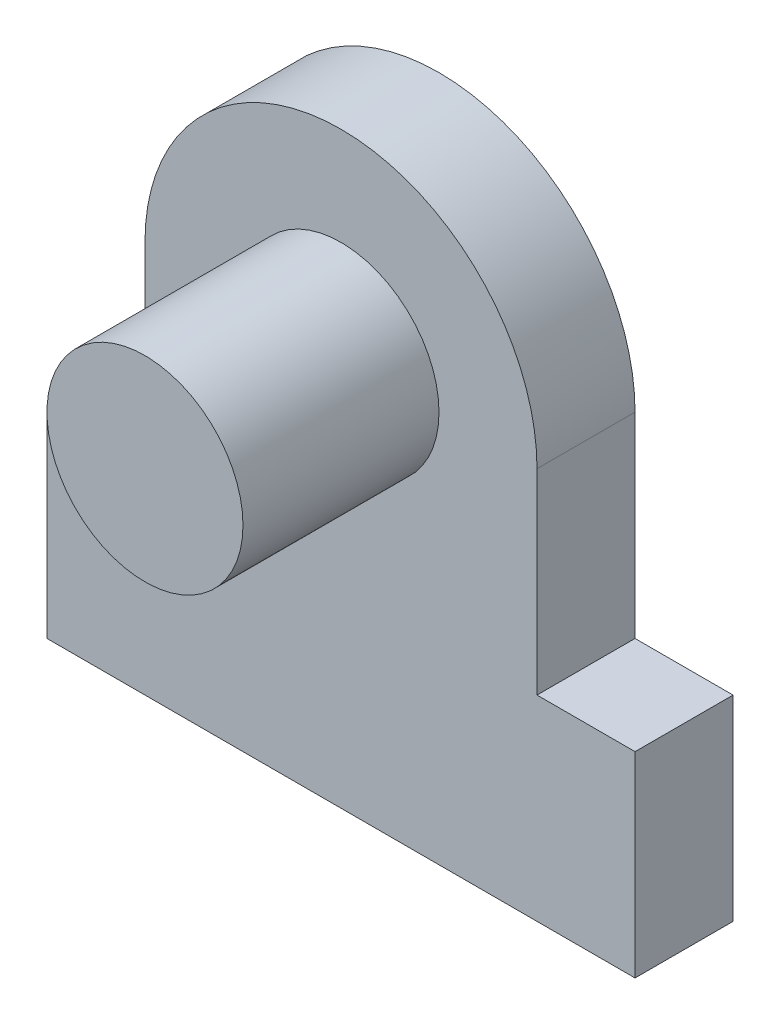
ISO-10303-21;
HEADER;
FILE_DESCRIPTION(('STEP AP214'),'2;1');
FILE_NAME('part.step','',(''),(''),'','','');
FILE_SCHEMA(('AUTOMOTIVE_DESIGN { 1 0 10303 214 1 1 1 1 }'));
ENDSEC;
DATA;
#1=APPLICATION_CONTEXT('core data for automotive mechanical design processes');
#2=APPLICATION_PROTOCOL_DEFINITION('international standard','automotive_design',2000,#1);
#3=PRODUCT_CONTEXT('',#1,'mechanical');
#4=PRODUCT('Part','Part','',(#3));
#5=PRODUCT_RELATED_PRODUCT_CATEGORY('part','',(#4));
#6=PRODUCT_DEFINITION_FORMATION('','',#4);
#7=PRODUCT_DEFINITION_CONTEXT('part definition',#1,'design');
#8=PRODUCT_DEFINITION('design','',#6,#7);
#9=PRODUCT_DEFINITION_SHAPE('','',#8);
#10=(LENGTH_UNIT() NAMED_UNIT(*) SI_UNIT(.MILLI.,.METRE.));
#11=(NAMED_UNIT(*) PLANE_ANGLE_UNIT() SI_UNIT($,.RADIAN.));
#12=(NAMED_UNIT(*) SI_UNIT($,.STERADIAN.) SOLID_ANGLE_UNIT());
#13=UNCERTAINTY_MEASURE_WITH_UNIT(LENGTH_MEASURE(1.E-05),#10,'distance_accuracy_value','');
#14=(GEOMETRIC_REPRESENTATION_CONTEXT(3) GLOBAL_UNCERTAINTY_ASSIGNED_CONTEXT((#13)) GLOBAL_UNIT_ASSIGNED_CONTEXT((#10,
#11,#12)) REPRESENTATION_CONTEXT('',''));
#15=CARTESIAN_POINT('',(0.,0.,0.));
#16=DIRECTION('',(0.,0.,1.));
#17=DIRECTION('',(1.,0.,0.));
#18=AXIS2_PLACEMENT_3D('',#15,#16,#17);
#19=CARTESIAN_POINT('',(30.,0.,10.));
#20=DIRECTION('',(-1.,0.,0.));
#21=DIRECTION('',(0.,0.,1.));
#22=AXIS2_PLACEMENT_3D('',#19,#20,#21);
#23=PLANE('',#22);
#24=DIRECTION('',(0.,1.,0.));
#25=VECTOR('',#24,1.);
#26=CARTESIAN_POINT('',(30.,0.,0.));
#27=LINE('',#26,#25);
#28=CARTESIAN_POINT('',(30.,0.,0.));
#29=VERTEX_POINT('',#28);
#30=CARTESIAN_POINT('',(30.,20.,0.));
#31=VERTEX_POINT('',#30);
#32=EDGE_CURVE('E129',#29,#31,#27,.T.);
#33=ORIENTED_EDGE('',*,*,#32,.T.);
#34=DIRECTION('',(0.,0.,-1.));
#35=VECTOR('',#34,1.);
#36=CARTESIAN_POINT('',(30.,20.,10.));
#37=LINE('',#36,#35);
#38=CARTESIAN_POINT('',(30.,20.,10.));
#39=VERTEX_POINT('',#38);
#40=EDGE_CURVE('E11',#39,#31,#37,.T.);
#41=ORIENTED_EDGE('',*,*,#40,.F.);
#42=DIRECTION('',(0.,1.,0.));
#43=VECTOR('',#42,1.);
#44=CARTESIAN_POINT('',(30.,0.,10.));
#45=LINE('',#44,#43);
#46=CARTESIAN_POINT('',(30.,0.,10.));
#47=VERTEX_POINT('',#46);
#48=EDGE_CURVE('E144',#47,#39,#45,.T.);
#49=ORIENTED_EDGE('',*,*,#48,.F.);
#50=DIRECTION('',(0.,0.,-1.));
#51=VECTOR('',#50,1.);
#52=CARTESIAN_POINT('',(30.,0.,10.));
#53=LINE('',#52,#51);
#54=EDGE_CURVE('E125',#47,#29,#53,.T.);
#55=ORIENTED_EDGE('',*,*,#54,.T.);
#56=EDGE_LOOP('',(#33,#41,#49,#55));
#57=FACE_BOUND('',#56,.T.);
#58=ADVANCED_FACE('F33',(#57),#23,.F.);
#59=CARTESIAN_POINT('',(30.,20.,10.));
#60=DIRECTION('',(0.,-1.,0.));
#61=DIRECTION('',(0.,0.,-1.));
#62=AXIS2_PLACEMENT_3D('',#59,#60,#61);
#63=PLANE('',#62);
#64=DIRECTION('',(-1.,0.,0.));
#65=VECTOR('',#64,1.);
#66=CARTESIAN_POINT('',(30.,20.,0.));
#67=LINE('',#66,#65);
#68=CARTESIAN_POINT('',(20.,20.,0.));
#69=VERTEX_POINT('',#68);
#70=EDGE_CURVE('E132',#31,#69,#67,.T.);
#71=ORIENTED_EDGE('',*,*,#70,.T.);
#72=DIRECTION('',(0.,0.,-1.));
#73=VECTOR('',#72,1.);
#74=CARTESIAN_POINT('',(20.,20.,10.));
#75=LINE('',#74,#73);
#76=CARTESIAN_POINT('',(20.,20.,10.));
#77=VERTEX_POINT('',#76);
#78=EDGE_CURVE('E41',#77,#69,#75,.T.);
#79=ORIENTED_EDGE('',*,*,#78,.F.);
#80=DIRECTION('',(-1.,0.,0.));
#81=VECTOR('',#80,1.);
#82=CARTESIAN_POINT('',(30.,20.,10.));
#83=LINE('',#82,#81);
#84=EDGE_CURVE('E92',#39,#77,#83,.T.);
#85=ORIENTED_EDGE('',*,*,#84,.F.);
#86=ORIENTED_EDGE('',*,*,#40,.T.);
#87=EDGE_LOOP('',(#71,#79,#85,#86));
#88=FACE_BOUND('',#87,.T.);
#89=ADVANCED_FACE('F201',(#88),#63,.F.);
#90=CARTESIAN_POINT('',(20.,20.,10.));
#91=DIRECTION('',(-1.,0.,0.));
#92=DIRECTION('',(0.,0.,1.));
#93=AXIS2_PLACEMENT_3D('',#90,#91,#92);
#94=PLANE('',#93);
#95=DIRECTION('',(0.,1.,0.));
#96=VECTOR('',#95,1.);
#97=CARTESIAN_POINT('',(20.,20.,0.));
#98=LINE('',#97,#96);
#99=CARTESIAN_POINT('',(20.,40.,0.));
#100=VERTEX_POINT('',#99);
#101=EDGE_CURVE('E135',#69,#100,#98,.T.);
#102=ORIENTED_EDGE('',*,*,#101,.T.);
#103=DIRECTION('',(0.,0.,-1.));
#104=VECTOR('',#103,1.);
#105=CARTESIAN_POINT('',(20.,40.,10.));
#106=LINE('',#105,#104);
#107=CARTESIAN_POINT('',(20.,40.,10.));
#108=VERTEX_POINT('',#107);
#109=EDGE_CURVE('E151',#108,#100,#106,.T.);
#110=ORIENTED_EDGE('',*,*,#109,.F.);
#111=DIRECTION('',(0.,1.,0.));
#112=VECTOR('',#111,1.);
#113=CARTESIAN_POINT('',(20.,20.,10.));
#114=LINE('',#113,#112);
#115=EDGE_CURVE('E159',#77,#108,#114,.T.);
#116=ORIENTED_EDGE('',*,*,#115,.F.);
#117=ORIENTED_EDGE('',*,*,#78,.T.);
#118=EDGE_LOOP('',(#102,#110,#116,#117));
#119=FACE_BOUND('',#118,.T.);
#120=ADVANCED_FACE('F157',(#119),#94,.F.);
#121=CARTESIAN_POINT('',(0.,40.,10.));
#122=DIRECTION('',(0.,0.,-1.));
#123=DIRECTION('',(-1.,0.,0.));
#124=AXIS2_PLACEMENT_3D('',#121,#122,#123);
#125=CYLINDRICAL_SURFACE('',#124,20.);
#126=CARTESIAN_POINT('',(0.,40.,0.));
#127=DIRECTION('',(0.,0.,1.));
#128=DIRECTION('',(1.,0.,0.));
#129=AXIS2_PLACEMENT_3D('',#126,#127,#128);
#130=CIRCLE('',#129,20.);
#131=CARTESIAN_POINT('',(-20.,40.,0.));
#132=VERTEX_POINT('',#131);
#133=EDGE_CURVE('E137',#100,#132,#130,.T.);
#134=ORIENTED_EDGE('',*,*,#133,.T.);
#135=DIRECTION('',(0.,0.,-1.));
#136=VECTOR('',#135,1.);
#137=CARTESIAN_POINT('',(-20.,40.,10.));
#138=LINE('',#137,#136);
#139=CARTESIAN_POINT('',(-20.,40.,10.));
#140=VERTEX_POINT('',#139);
#141=EDGE_CURVE('E148',#140,#132,#138,.T.);
#142=ORIENTED_EDGE('',*,*,#141,.F.);
#143=CARTESIAN_POINT('',(0.,40.,10.));
#144=DIRECTION('',(0.,0.,1.));
#145=DIRECTION('',(1.,0.,0.));
#146=AXIS2_PLACEMENT_3D('',#143,#144,#145);
#147=CIRCLE('',#146,20.);
#148=EDGE_CURVE('E171',#108,#140,#147,.T.);
#149=ORIENTED_EDGE('',*,*,#148,.F.);
#150=ORIENTED_EDGE('',*,*,#109,.T.);
#151=EDGE_LOOP('',(#134,#142,#149,#150));
#152=FACE_BOUND('',#151,.T.);
#153=ADVANCED_FACE('F167',(#152),#125,.T.);
#154=CARTESIAN_POINT('',(-20.,20.,10.));
#155=DIRECTION('',(1.,0.,0.));
#156=DIRECTION('',(0.,0.,-1.));
#157=AXIS2_PLACEMENT_3D('',#154,#155,#156);
#158=PLANE('',#157);
#159=DIRECTION('',(0.,-1.,0.));
#160=VECTOR('',#159,1.);
#161=CARTESIAN_POINT('',(-20.,20.,0.));
#162=LINE('',#161,#160);
#163=CARTESIAN_POINT('',(-20.,20.,0.));
#164=VERTEX_POINT('',#163);
#165=EDGE_CURVE('E139',#132,#164,#162,.T.);
#166=ORIENTED_EDGE('',*,*,#165,.T.);
#167=DIRECTION('',(0.,0.,-1.));
#168=VECTOR('',#167,1.);
#169=CARTESIAN_POINT('',(-20.,20.,10.));
#170=LINE('',#169,#168);
#171=CARTESIAN_POINT('',(-20.,20.,10.));
#172=VERTEX_POINT('',#171);
#173=EDGE_CURVE('E120',#172,#164,#170,.T.);
#174=ORIENTED_EDGE('',*,*,#173,.F.);
#175=DIRECTION('',(0.,-1.,0.));
#176=VECTOR('',#175,1.);
#177=CARTESIAN_POINT('',(-20.,20.,10.));
#178=LINE('',#177,#176);
#179=EDGE_CURVE('E111',#140,#172,#178,.T.);
#180=ORIENTED_EDGE('',*,*,#179,.F.);
#181=ORIENTED_EDGE('',*,*,#141,.T.);
#182=EDGE_LOOP('',(#166,#174,#180,#181));
#183=FACE_BOUND('',#182,.T.);
#184=ADVANCED_FACE('F170',(#183),#158,.F.);
#185=CARTESIAN_POINT('',(-30.,20.,10.));
#186=DIRECTION('',(0.,-1.,0.));
#187=DIRECTION('',(0.,0.,-1.));
#188=AXIS2_PLACEMENT_3D('',#185,#186,#187);
#189=PLANE('',#188);
#190=DIRECTION('',(-1.,0.,0.));
#191=VECTOR('',#190,1.);
#192=CARTESIAN_POINT('',(-30.,20.,0.));
#193=LINE('',#192,#191);
#194=CARTESIAN_POINT('',(-30.,20.,0.));
#195=VERTEX_POINT('',#194);
#196=EDGE_CURVE('E119',#164,#195,#193,.T.);
#197=ORIENTED_EDGE('',*,*,#196,.T.);
#198=DIRECTION('',(0.,0.,-1.));
#199=VECTOR('',#198,1.);
#200=CARTESIAN_POINT('',(-30.,20.,10.));
#201=LINE('',#200,#199);
#202=CARTESIAN_POINT('',(-30.,20.,10.));
#203=VERTEX_POINT('',#202);
#204=EDGE_CURVE('E116',#203,#195,#201,.T.);
#205=ORIENTED_EDGE('',*,*,#204,.F.);
#206=DIRECTION('',(-1.,0.,0.));
#207=VECTOR('',#206,1.);
#208=CARTESIAN_POINT('',(-30.,20.,10.));
#209=LINE('',#208,#207);
#210=EDGE_CURVE('E105',#172,#203,#209,.T.);
#211=ORIENTED_EDGE('',*,*,#210,.F.);
#212=ORIENTED_EDGE('',*,*,#173,.T.);
#213=EDGE_LOOP('',(#197,#205,#211,#212));
#214=FACE_BOUND('',#213,.T.);
#215=ADVANCED_FACE('F117',(#214),#189,.F.);
#216=CARTESIAN_POINT('',(-30.,0.,10.));
#217=DIRECTION('',(1.,0.,0.));
#218=DIRECTION('',(0.,0.,-1.));
#219=AXIS2_PLACEMENT_3D('',#216,#217,#218);
#220=PLANE('',#219);
#221=DIRECTION('',(0.,-1.,0.));
#222=VECTOR('',#221,1.);
#223=CARTESIAN_POINT('',(-30.,0.,0.));
#224=LINE('',#223,#222);
#225=CARTESIAN_POINT('',(-30.,0.,0.));
#226=VERTEX_POINT('',#225);
#227=EDGE_CURVE('E78',#195,#226,#224,.T.);
#228=ORIENTED_EDGE('',*,*,#227,.T.);
#229=DIRECTION('',(0.,0.,-1.));
#230=VECTOR('',#229,1.);
#231=CARTESIAN_POINT('',(-30.,0.,10.));
#232=LINE('',#231,#230);
#233=CARTESIAN_POINT('',(-30.,0.,10.));
#234=VERTEX_POINT('',#233);
#235=EDGE_CURVE('E121',#234,#226,#232,.T.);
#236=ORIENTED_EDGE('',*,*,#235,.F.);
#237=DIRECTION('',(0.,-1.,0.));
#238=VECTOR('',#237,1.);
#239=CARTESIAN_POINT('',(-30.,0.,10.));
#240=LINE('',#239,#238);
#241=EDGE_CURVE('E109',#203,#234,#240,.T.);
#242=ORIENTED_EDGE('',*,*,#241,.F.);
#243=ORIENTED_EDGE('',*,*,#204,.T.);
#244=EDGE_LOOP('',(#228,#236,#242,#243));
#245=FACE_BOUND('',#244,.T.);
#246=ADVANCED_FACE('F123',(#245),#220,.F.);
#247=CARTESIAN_POINT('',(-30.,0.,10.));
#248=DIRECTION('',(0.,1.,0.));
#249=DIRECTION('',(0.,0.,1.));
#250=AXIS2_PLACEMENT_3D('',#247,#248,#249);
#251=PLANE('',#250);
#252=DIRECTION('',(1.,0.,0.));
#253=VECTOR('',#252,1.);
#254=CARTESIAN_POINT('',(-30.,0.,0.));
#255=LINE('',#254,#253);
#256=EDGE_CURVE('E84',#226,#29,#255,.T.);
#257=ORIENTED_EDGE('',*,*,#256,.T.);
#258=ORIENTED_EDGE('',*,*,#54,.F.);
#259=DIRECTION('',(1.,0.,0.));
#260=VECTOR('',#259,1.);
#261=CARTESIAN_POINT('',(-30.,0.,10.));
#262=LINE('',#261,#260);
#263=EDGE_CURVE('E49',#234,#47,#262,.T.);
#264=ORIENTED_EDGE('',*,*,#263,.F.);
#265=ORIENTED_EDGE('',*,*,#235,.T.);
#266=EDGE_LOOP('',(#257,#258,#264,#265));
#267=FACE_BOUND('',#266,.T.);
#268=ADVANCED_FACE('F192',(#267),#251,.F.);
#269=CARTESIAN_POINT('',(0.,40.,10.));
#270=DIRECTION('',(0.,0.,1.));
#271=DIRECTION('',(1.,0.,0.));
#272=AXIS2_PLACEMENT_3D('',#269,#270,#271);
#273=PLANE('',#272);
#274=CARTESIAN_POINT('',(0.,40.,10.));
#275=DIRECTION('',(0.,0.,1.));
#276=DIRECTION('',(1.,0.,0.));
#277=AXIS2_PLACEMENT_3D('',#274,#275,#276);
#278=CIRCLE('',#277,10.);
#279=CARTESIAN_POINT('',(10.,40.,10.));
#280=VERTEX_POINT('',#279);
#281=EDGE_CURVE('E177',#280,#280,#278,.T.);
#282=ORIENTED_EDGE('',*,*,#281,.F.);
#283=EDGE_LOOP('',(#282));
#284=FACE_BOUND('',#283,.T.);
#285=ORIENTED_EDGE('',*,*,#48,.T.);
#286=ORIENTED_EDGE('',*,*,#84,.T.);
#287=ORIENTED_EDGE('',*,*,#115,.T.);
#288=ORIENTED_EDGE('',*,*,#148,.T.);
#289=ORIENTED_EDGE('',*,*,#179,.T.);
#290=ORIENTED_EDGE('',*,*,#210,.T.);
#291=ORIENTED_EDGE('',*,*,#241,.T.);
#292=ORIENTED_EDGE('',*,*,#263,.T.);
#293=EDGE_LOOP('',(#285,#286,#287,#288,#289,#290,#291,#292));
#294=FACE_BOUND('',#293,.T.);
#295=ADVANCED_FACE('F107',(#284,#294),#273,.T.);
#296=CARTESIAN_POINT('',(0.,40.,0.));
#297=DIRECTION('',(0.,0.,1.));
#298=DIRECTION('',(1.,0.,0.));
#299=AXIS2_PLACEMENT_3D('',#296,#297,#298);
#300=PLANE('',#299);
#301=ORIENTED_EDGE('',*,*,#32,.F.);
#302=ORIENTED_EDGE('',*,*,#256,.F.);
#303=ORIENTED_EDGE('',*,*,#227,.F.);
#304=ORIENTED_EDGE('',*,*,#196,.F.);
#305=ORIENTED_EDGE('',*,*,#165,.F.);
#306=ORIENTED_EDGE('',*,*,#133,.F.);
#307=ORIENTED_EDGE('',*,*,#101,.F.);
#308=ORIENTED_EDGE('',*,*,#70,.F.);
#309=EDGE_LOOP('',(#301,#302,#303,#304,#305,#306,#307,#308));
#310=FACE_BOUND('',#309,.T.);
#311=ADVANCED_FACE('F163',(#310),#300,.F.);
#312=CARTESIAN_POINT('',(0.,40.,30.));
#313=DIRECTION('',(0.,0.,-1.));
#314=DIRECTION('',(-1.,0.,0.));
#315=AXIS2_PLACEMENT_3D('',#312,#313,#314);
#316=CYLINDRICAL_SURFACE('',#315,10.);
#317=CARTESIAN_POINT('',(0.,40.,30.));
#318=DIRECTION('',(0.,0.,1.));
#319=DIRECTION('',(1.,0.,0.));
#320=AXIS2_PLACEMENT_3D('',#317,#318,#319);
#321=CIRCLE('',#320,10.);
#322=CARTESIAN_POINT('',(10.,40.,30.));
#323=VERTEX_POINT('',#322);
#324=EDGE_CURVE('E133',#323,#323,#321,.T.);
#325=ORIENTED_EDGE('',*,*,#324,.F.);
#326=EDGE_LOOP('',(#325));
#327=FACE_BOUND('',#326,.T.);
#328=ORIENTED_EDGE('',*,*,#281,.T.);
#329=EDGE_LOOP('',(#328));
#330=FACE_BOUND('',#329,.T.);
#331=ADVANCED_FACE('F185',(#327,#330),#316,.T.);
#332=CARTESIAN_POINT('',(0.,40.,30.));
#333=DIRECTION('',(0.,0.,1.));
#334=DIRECTION('',(1.,0.,0.));
#335=AXIS2_PLACEMENT_3D('',#332,#333,#334);
#336=PLANE('',#335);
#337=ORIENTED_EDGE('',*,*,#324,.T.);
#338=EDGE_LOOP('',(#337));
#339=FACE_BOUND('',#338,.T.);
#340=ADVANCED_FACE('F183',(#339),#336,.T.);
#341=CLOSED_SHELL('',(#58,#89,#120,#153,#184,#215,#246,#268,#295,#311,#331,#340));
#342=MANIFOLD_SOLID_BREP('B2',#341);
#343=ADVANCED_BREP_SHAPE_REPRESENTATION('',(#18,#342),#14);
#344=SHAPE_DEFINITION_REPRESENTATION(#9,#343);
ENDSEC;
END-ISO-10303-21;
